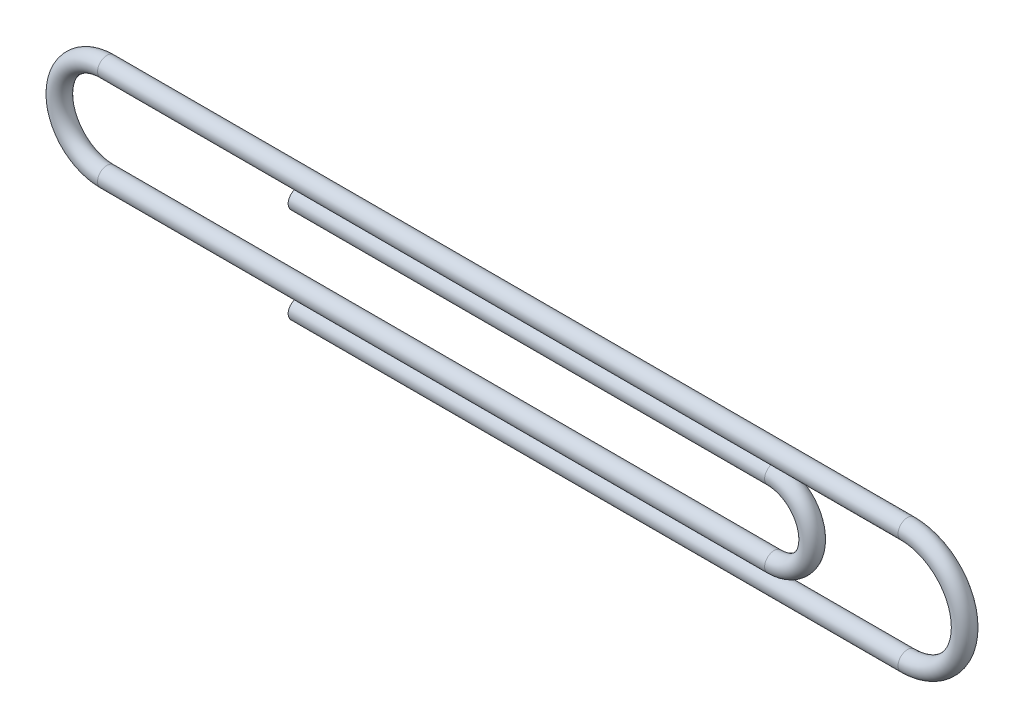
ISO-10303-21;
HEADER;
FILE_DESCRIPTION(('STEP AP214'),'2;1');
FILE_NAME('part.step','',(''),(''),'','','');
FILE_SCHEMA(('AUTOMOTIVE_DESIGN { 1 0 10303 214 1 1 1 1 }'));
ENDSEC;
DATA;
#1=APPLICATION_CONTEXT('core data for automotive mechanical design processes');
#2=APPLICATION_PROTOCOL_DEFINITION('international standard','automotive_design',2000,#1);
#3=PRODUCT_CONTEXT('',#1,'mechanical');
#4=PRODUCT('Part','Part','',(#3));
#5=PRODUCT_RELATED_PRODUCT_CATEGORY('part','',(#4));
#6=PRODUCT_DEFINITION_FORMATION('','',#4);
#7=PRODUCT_DEFINITION_CONTEXT('part definition',#1,'design');
#8=PRODUCT_DEFINITION('design','',#6,#7);
#9=PRODUCT_DEFINITION_SHAPE('','',#8);
#10=(LENGTH_UNIT() NAMED_UNIT(*) SI_UNIT(.MILLI.,.METRE.));
#11=(NAMED_UNIT(*) PLANE_ANGLE_UNIT() SI_UNIT($,.RADIAN.));
#12=(NAMED_UNIT(*) SI_UNIT($,.STERADIAN.) SOLID_ANGLE_UNIT());
#13=UNCERTAINTY_MEASURE_WITH_UNIT(LENGTH_MEASURE(1.E-05),#10,'distance_accuracy_value','');
#14=(GEOMETRIC_REPRESENTATION_CONTEXT(3) GLOBAL_UNCERTAINTY_ASSIGNED_CONTEXT((#13)) GLOBAL_UNIT_ASSIGNED_CONTEXT((#10,
#11,#12)) REPRESENTATION_CONTEXT('',''));
#15=CARTESIAN_POINT('',(0.,0.,0.));
#16=DIRECTION('',(0.,0.,1.));
#17=DIRECTION('',(1.,0.,0.));
#18=AXIS2_PLACEMENT_3D('',#15,#16,#17);
#19=CARTESIAN_POINT('',(0.,0.,0.));
#20=DIRECTION('',(1.,0.,0.));
#21=DIRECTION('',(0.,0.,-1.));
#22=AXIS2_PLACEMENT_3D('',#19,#20,#21);
#23=PLANE('',#22);
#24=CARTESIAN_POINT('',(0.,0.,0.));
#25=DIRECTION('',(1.,0.,0.));
#26=DIRECTION('',(0.,0.,-1.));
#27=AXIS2_PLACEMENT_3D('',#24,#25,#26);
#28=CIRCLE('',#27,0.495);
#29=CARTESIAN_POINT('',(0.,0.,-0.495));
#30=VERTEX_POINT('',#29);
#31=EDGE_CURVE('E49',#30,#30,#28,.T.);
#32=ORIENTED_EDGE('',*,*,#31,.F.);
#33=EDGE_LOOP('',(#32));
#34=FACE_BOUND('',#33,.T.);
#35=ADVANCED_FACE('F37',(#34),#23,.F.);
#36=CARTESIAN_POINT('',(0.,-5.,0.));
#37=DIRECTION('',(-1.,0.,0.));
#38=DIRECTION('',(0.,0.,-1.));
#39=AXIS2_PLACEMENT_3D('',#36,#37,#38);
#40=PLANE('',#39);
#41=CARTESIAN_POINT('',(0.,-5.,0.));
#42=DIRECTION('',(-1.,0.,0.));
#43=DIRECTION('',(0.,0.,-1.));
#44=AXIS2_PLACEMENT_3D('',#41,#42,#43);
#45=CIRCLE('',#44,0.495);
#46=CARTESIAN_POINT('',(0.,-5.,-0.495));
#47=VERTEX_POINT('',#46);
#48=EDGE_CURVE('E11',#47,#47,#45,.T.);
#49=ORIENTED_EDGE('',*,*,#48,.T.);
#50=EDGE_LOOP('',(#49));
#51=FACE_BOUND('',#50,.T.);
#52=ADVANCED_FACE('F52',(#51),#40,.T.);
#53=CARTESIAN_POINT('',(0.,0.,0.));
#54=DIRECTION('',(1.,0.,0.));
#55=DIRECTION('',(0.,0.,-1.));
#56=AXIS2_PLACEMENT_3D('',#53,#54,#55);
#57=CYLINDRICAL_SURFACE('',#56,0.495);
#58=CARTESIAN_POINT('',(25.,0.,0.));
#59=DIRECTION('',(1.,0.,0.));
#60=DIRECTION('',(0.,0.,-1.));
#61=AXIS2_PLACEMENT_3D('',#58,#59,#60);
#62=CIRCLE('',#61,0.495);
#63=CARTESIAN_POINT('',(25.,0.495,0.));
#64=VERTEX_POINT('',#63);
#65=EDGE_CURVE('E75',#64,#64,#62,.T.);
#66=ORIENTED_EDGE('',*,*,#65,.F.);
#67=EDGE_LOOP('',(#66));
#68=FACE_BOUND('',#67,.T.);
#69=ORIENTED_EDGE('',*,*,#31,.T.);
#70=EDGE_LOOP('',(#69));
#71=FACE_BOUND('',#70,.T.);
#72=ADVANCED_FACE('F79',(#68,#71),#57,.T.);
#73=CARTESIAN_POINT('',(25.,-2.,0.));
#74=DIRECTION('',(0.,0.,-1.));
#75=DIRECTION('',(-1.,0.,0.));
#76=AXIS2_PLACEMENT_3D('',#73,#74,#75);
#77=TOROIDAL_SURFACE('',#76,2.,0.495);
#78=CARTESIAN_POINT('',(25.,-4.,0.));
#79=DIRECTION('',(-1.,0.,0.));
#80=DIRECTION('',(0.,0.,-1.));
#81=AXIS2_PLACEMENT_3D('',#78,#79,#80);
#82=CIRCLE('',#81,0.495);
#83=CARTESIAN_POINT('',(25.,-4.495,0.));
#84=VERTEX_POINT('',#83);
#85=EDGE_CURVE('E72',#84,#84,#82,.T.);
#86=CARTESIAN_POINT('',(25.,-2.,0.));
#87=DIRECTION('',(0.,0.,-1.));
#88=DIRECTION('',(-1.,0.,0.));
#89=AXIS2_PLACEMENT_3D('',#86,#87,#88);
#90=CIRCLE('',#89,2.495);
#91=EDGE_CURVE('',#64,#84,#90,.T.);
#92=ORIENTED_EDGE('',*,*,#65,.T.);
#93=ORIENTED_EDGE('',*,*,#85,.F.);
#94=ORIENTED_EDGE('',*,*,#91,.T.);
#95=ORIENTED_EDGE('',*,*,#91,.F.);
#96=EDGE_LOOP('',(#92,#94,#93,#95));
#97=FACE_BOUND('',#96,.T.);
#98=ADVANCED_FACE('F81',(#97),#77,.T.);
#99=CARTESIAN_POINT('',(25.,-4.,0.));
#100=DIRECTION('',(-1.,0.,0.));
#101=DIRECTION('',(0.,-1.,0.));
#102=AXIS2_PLACEMENT_3D('',#99,#100,#101);
#103=CYLINDRICAL_SURFACE('',#102,0.495);
#104=CARTESIAN_POINT('',(-10.,-4.,0.));
#105=DIRECTION('',(-1.,0.,0.));
#106=DIRECTION('',(0.,0.,-1.));
#107=AXIS2_PLACEMENT_3D('',#104,#105,#106);
#108=CIRCLE('',#107,0.495);
#109=CARTESIAN_POINT('',(-10.,-4.495,0.));
#110=VERTEX_POINT('',#109);
#111=EDGE_CURVE('E69',#110,#110,#108,.T.);
#112=ORIENTED_EDGE('',*,*,#111,.F.);
#113=EDGE_LOOP('',(#112));
#114=FACE_BOUND('',#113,.T.);
#115=ORIENTED_EDGE('',*,*,#85,.T.);
#116=EDGE_LOOP('',(#115));
#117=FACE_BOUND('',#116,.T.);
#118=ADVANCED_FACE('F88',(#114,#117),#103,.T.);
#119=CARTESIAN_POINT('',(-10.,-1.5,0.));
#120=DIRECTION('',(0.,0.,-1.));
#121=DIRECTION('',(-1.,0.,0.));
#122=AXIS2_PLACEMENT_3D('',#119,#120,#121);
#123=TOROIDAL_SURFACE('',#122,2.5,0.495);
#124=CARTESIAN_POINT('',(-10.,1.,0.));
#125=DIRECTION('',(1.,0.,0.));
#126=DIRECTION('',(0.,0.,-1.));
#127=AXIS2_PLACEMENT_3D('',#124,#125,#126);
#128=CIRCLE('',#127,0.495);
#129=CARTESIAN_POINT('',(-10.,1.495,0.));
#130=VERTEX_POINT('',#129);
#131=EDGE_CURVE('E64',#130,#130,#128,.T.);
#132=CARTESIAN_POINT('',(-10.,-1.5,0.));
#133=DIRECTION('',(0.,0.,-1.));
#134=DIRECTION('',(-1.,0.,0.));
#135=AXIS2_PLACEMENT_3D('',#132,#133,#134);
#136=CIRCLE('',#135,2.995);
#137=EDGE_CURVE('',#110,#130,#136,.T.);
#138=ORIENTED_EDGE('',*,*,#111,.T.);
#139=ORIENTED_EDGE('',*,*,#131,.F.);
#140=ORIENTED_EDGE('',*,*,#137,.T.);
#141=ORIENTED_EDGE('',*,*,#137,.F.);
#142=EDGE_LOOP('',(#138,#140,#139,#141));
#143=FACE_BOUND('',#142,.T.);
#144=ADVANCED_FACE('F95',(#143),#123,.T.);
#145=CARTESIAN_POINT('',(-10.,1.,0.));
#146=DIRECTION('',(1.,0.,0.));
#147=DIRECTION('',(0.,0.,-1.));
#148=AXIS2_PLACEMENT_3D('',#145,#146,#147);
#149=CYLINDRICAL_SURFACE('',#148,0.495);
#150=CARTESIAN_POINT('',(32.,1.,0.));
#151=DIRECTION('',(1.,0.,0.));
#152=DIRECTION('',(0.,0.,-1.));
#153=AXIS2_PLACEMENT_3D('',#150,#151,#152);
#154=CIRCLE('',#153,0.495);
#155=CARTESIAN_POINT('',(32.,1.495,0.));
#156=VERTEX_POINT('',#155);
#157=EDGE_CURVE('E62',#156,#156,#154,.T.);
#158=ORIENTED_EDGE('',*,*,#157,.F.);
#159=EDGE_LOOP('',(#158));
#160=FACE_BOUND('',#159,.T.);
#161=ORIENTED_EDGE('',*,*,#131,.T.);
#162=EDGE_LOOP('',(#161));
#163=FACE_BOUND('',#162,.T.);
#164=ADVANCED_FACE('F99',(#160,#163),#149,.T.);
#165=CARTESIAN_POINT('',(32.,-2.,0.));
#166=DIRECTION('',(0.,0.,-1.));
#167=DIRECTION('',(-1.,0.,0.));
#168=AXIS2_PLACEMENT_3D('',#165,#166,#167);
#169=TOROIDAL_SURFACE('',#168,3.,0.495);
#170=CARTESIAN_POINT('',(32.,-5.,0.));
#171=DIRECTION('',(-1.,0.,0.));
#172=DIRECTION('',(0.,0.,-1.));
#173=AXIS2_PLACEMENT_3D('',#170,#171,#172);
#174=CIRCLE('',#173,0.495);
#175=CARTESIAN_POINT('',(32.,-5.495,0.));
#176=VERTEX_POINT('',#175);
#177=EDGE_CURVE('E44',#176,#176,#174,.T.);
#178=CARTESIAN_POINT('',(32.,-2.,0.));
#179=DIRECTION('',(0.,0.,-1.));
#180=DIRECTION('',(-1.,0.,0.));
#181=AXIS2_PLACEMENT_3D('',#178,#179,#180);
#182=CIRCLE('',#181,3.495);
#183=EDGE_CURVE('',#156,#176,#182,.T.);
#184=ORIENTED_EDGE('',*,*,#157,.T.);
#185=ORIENTED_EDGE('',*,*,#177,.F.);
#186=ORIENTED_EDGE('',*,*,#183,.T.);
#187=ORIENTED_EDGE('',*,*,#183,.F.);
#188=EDGE_LOOP('',(#184,#186,#185,#187));
#189=FACE_BOUND('',#188,.T.);
#190=ADVANCED_FACE('F57',(#189),#169,.T.);
#191=CARTESIAN_POINT('',(32.,-5.,0.));
#192=DIRECTION('',(-1.,0.,0.));
#193=DIRECTION('',(0.,-1.,0.));
#194=AXIS2_PLACEMENT_3D('',#191,#192,#193);
#195=CYLINDRICAL_SURFACE('',#194,0.495);
#196=ORIENTED_EDGE('',*,*,#48,.F.);
#197=EDGE_LOOP('',(#196));
#198=FACE_BOUND('',#197,.T.);
#199=ORIENTED_EDGE('',*,*,#177,.T.);
#200=EDGE_LOOP('',(#199));
#201=FACE_BOUND('',#200,.T.);
#202=ADVANCED_FACE('F54',(#198,#201),#195,.T.);
#203=CLOSED_SHELL('',(#35,#52,#72,#98,#118,#144,#164,#190,#202));
#204=MANIFOLD_SOLID_BREP('B2',#203);
#205=ADVANCED_BREP_SHAPE_REPRESENTATION('',(#18,#204),#14);
#206=SHAPE_DEFINITION_REPRESENTATION(#9,#205);
ENDSEC;
END-ISO-10303-21;
